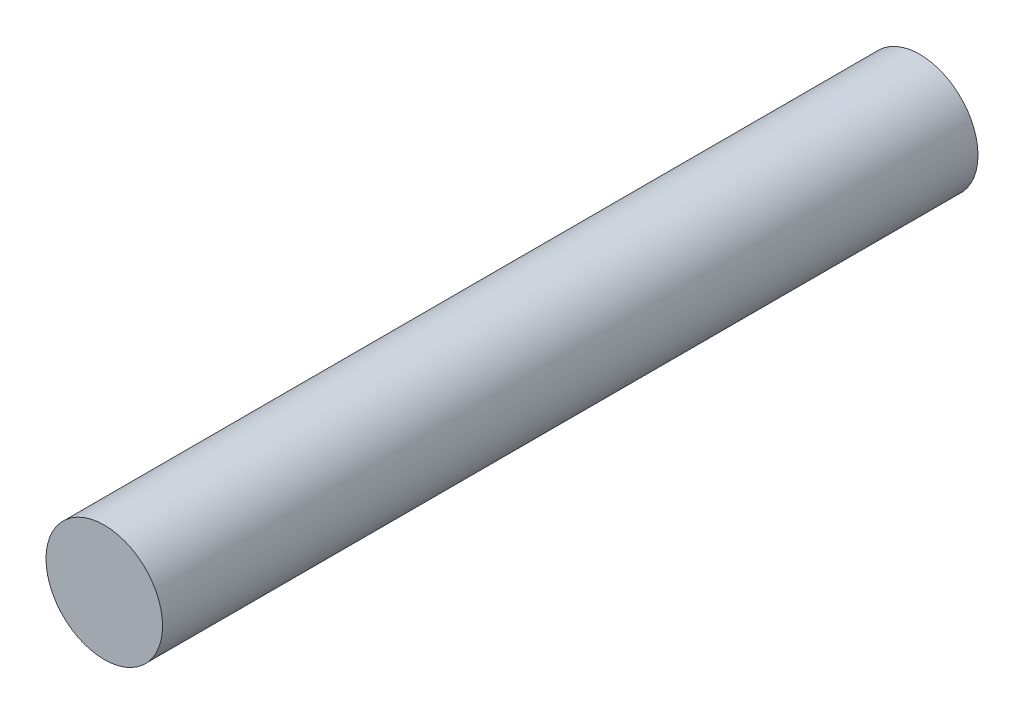
ISO-10303-21;
HEADER;
FILE_DESCRIPTION(('STEP AP214'),'2;1');
FILE_NAME('part.step','',(''),(''),'','','');
FILE_SCHEMA(('AUTOMOTIVE_DESIGN { 1 0 10303 214 1 1 1 1 }'));
ENDSEC;
DATA;
#1=APPLICATION_CONTEXT('core data for automotive mechanical design processes');
#2=APPLICATION_PROTOCOL_DEFINITION('international standard','automotive_design',2000,#1);
#3=PRODUCT_CONTEXT('',#1,'mechanical');
#4=PRODUCT('Part','Part','',(#3));
#5=PRODUCT_RELATED_PRODUCT_CATEGORY('part','',(#4));
#6=PRODUCT_DEFINITION_FORMATION('','',#4);
#7=PRODUCT_DEFINITION_CONTEXT('part definition',#1,'design');
#8=PRODUCT_DEFINITION('design','',#6,#7);
#9=PRODUCT_DEFINITION_SHAPE('','',#8);
#10=(LENGTH_UNIT() NAMED_UNIT(*) SI_UNIT(.MILLI.,.METRE.));
#11=(NAMED_UNIT(*) PLANE_ANGLE_UNIT() SI_UNIT($,.RADIAN.));
#12=(NAMED_UNIT(*) SI_UNIT($,.STERADIAN.) SOLID_ANGLE_UNIT());
#13=UNCERTAINTY_MEASURE_WITH_UNIT(LENGTH_MEASURE(1.E-05),#10,'distance_accuracy_value','');
#14=(GEOMETRIC_REPRESENTATION_CONTEXT(3) GLOBAL_UNCERTAINTY_ASSIGNED_CONTEXT((#13)) GLOBAL_UNIT_ASSIGNED_CONTEXT((#10,
#11,#12)) REPRESENTATION_CONTEXT('',''));
#15=CARTESIAN_POINT('',(0.,0.,0.));
#16=DIRECTION('',(0.,0.,1.));
#17=DIRECTION('',(1.,0.,0.));
#18=AXIS2_PLACEMENT_3D('',#15,#16,#17);
#19=CARTESIAN_POINT('',(0.,0.,11.1942399378468));
#20=DIRECTION('',(0.,0.,1.));
#21=DIRECTION('',(1.,0.,0.));
#22=AXIS2_PLACEMENT_3D('',#19,#20,#21);
#23=PLANE('',#22);
#24=CARTESIAN_POINT('',(0.,0.,11.1942399378468));
#25=DIRECTION('',(0.,0.,-1.));
#26=DIRECTION('',(-1.,0.,0.));
#27=AXIS2_PLACEMENT_3D('',#24,#25,#26);
#28=CIRCLE('',#27,1.6);
#29=CARTESIAN_POINT('',(-1.6,0.,11.1942399378468));
#30=VERTEX_POINT('',#29);
#31=EDGE_CURVE('E9',#30,#30,#28,.T.);
#32=ORIENTED_EDGE('',*,*,#31,.F.);
#33=EDGE_LOOP('',(#32));
#34=FACE_BOUND('',#33,.T.);
#35=ADVANCED_FACE('F14',(#34),#23,.T.);
#36=CARTESIAN_POINT('',(0.,0.,-11.1942399378468));
#37=DIRECTION('',(0.,0.,-1.));
#38=DIRECTION('',(-1.,0.,0.));
#39=AXIS2_PLACEMENT_3D('',#36,#37,#38);
#40=PLANE('',#39);
#41=CARTESIAN_POINT('',(0.,0.,-11.1942399378468));
#42=DIRECTION('',(0.,0.,1.));
#43=DIRECTION('',(1.,0.,0.));
#44=AXIS2_PLACEMENT_3D('',#41,#42,#43);
#45=CIRCLE('',#44,1.6);
#46=CARTESIAN_POINT('',(1.6,0.,-11.1942399378468));
#47=VERTEX_POINT('',#46);
#48=EDGE_CURVE('E21',#47,#47,#45,.T.);
#49=ORIENTED_EDGE('',*,*,#48,.F.);
#50=EDGE_LOOP('',(#49));
#51=FACE_BOUND('',#50,.T.);
#52=ADVANCED_FACE('F29',(#51),#40,.T.);
#53=CARTESIAN_POINT('',(0.,0.,-11.1942399378468));
#54=DIRECTION('',(0.,0.,1.));
#55=DIRECTION('',(1.,0.,0.));
#56=AXIS2_PLACEMENT_3D('',#53,#54,#55);
#57=CYLINDRICAL_SURFACE('',#56,1.6);
#58=ORIENTED_EDGE('',*,*,#31,.T.);
#59=EDGE_LOOP('',(#58));
#60=FACE_BOUND('',#59,.T.);
#61=ORIENTED_EDGE('',*,*,#48,.T.);
#62=EDGE_LOOP('',(#61));
#63=FACE_BOUND('',#62,.T.);
#64=ADVANCED_FACE('F16',(#60,#63),#57,.T.);
#65=CLOSED_SHELL('',(#35,#52,#64));
#66=MANIFOLD_SOLID_BREP('B1',#65);
#67=ADVANCED_BREP_SHAPE_REPRESENTATION('',(#18,#66),#14);
#68=SHAPE_DEFINITION_REPRESENTATION(#9,#67);
ENDSEC;
END-ISO-10303-21;
